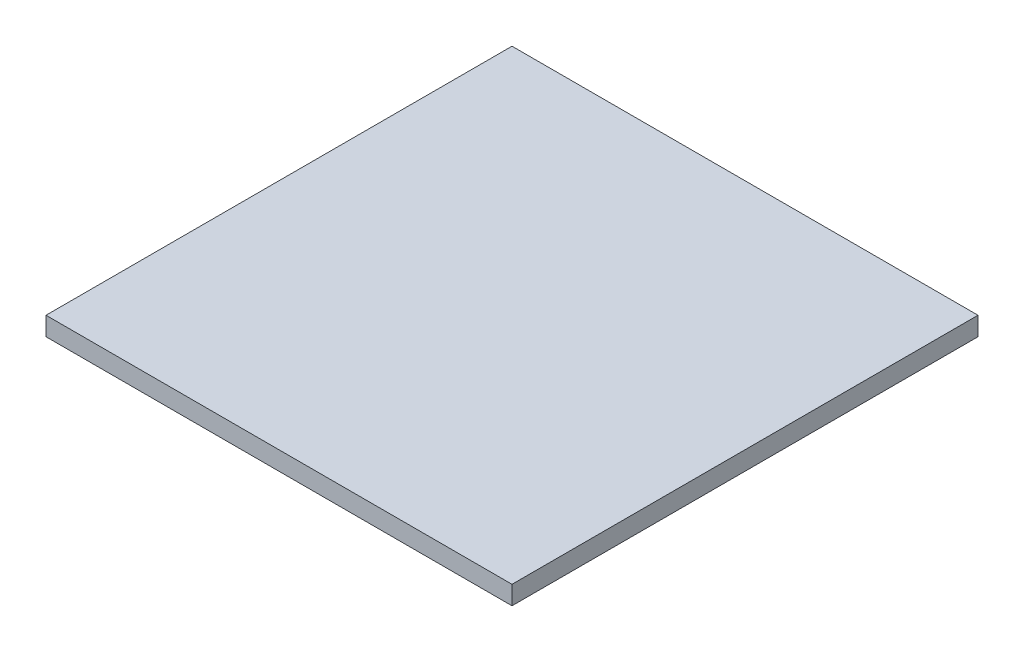
ISO-10303-21;
HEADER;
FILE_DESCRIPTION(('STEP AP214'),'2;1');
FILE_NAME('part.step','',(''),(''),'','','');
FILE_SCHEMA(('AUTOMOTIVE_DESIGN { 1 0 10303 214 1 1 1 1 }'));
ENDSEC;
DATA;
#1=APPLICATION_CONTEXT('core data for automotive mechanical design processes');
#2=APPLICATION_PROTOCOL_DEFINITION('international standard','automotive_design',2000,#1);
#3=PRODUCT_CONTEXT('',#1,'mechanical');
#4=PRODUCT('Part','Part','',(#3));
#5=PRODUCT_RELATED_PRODUCT_CATEGORY('part','',(#4));
#6=PRODUCT_DEFINITION_FORMATION('','',#4);
#7=PRODUCT_DEFINITION_CONTEXT('part definition',#1,'design');
#8=PRODUCT_DEFINITION('design','',#6,#7);
#9=PRODUCT_DEFINITION_SHAPE('','',#8);
#10=(LENGTH_UNIT() NAMED_UNIT(*) SI_UNIT(.MILLI.,.METRE.));
#11=(NAMED_UNIT(*) PLANE_ANGLE_UNIT() SI_UNIT($,.RADIAN.));
#12=(NAMED_UNIT(*) SI_UNIT($,.STERADIAN.) SOLID_ANGLE_UNIT());
#13=UNCERTAINTY_MEASURE_WITH_UNIT(LENGTH_MEASURE(1.E-05),#10,'distance_accuracy_value','');
#14=(GEOMETRIC_REPRESENTATION_CONTEXT(3) GLOBAL_UNCERTAINTY_ASSIGNED_CONTEXT((#13)) GLOBAL_UNIT_ASSIGNED_CONTEXT((#10,
#11,#12)) REPRESENTATION_CONTEXT('',''));
#15=CARTESIAN_POINT('',(0.,0.,0.));
#16=DIRECTION('',(0.,0.,1.));
#17=DIRECTION('',(1.,0.,0.));
#18=AXIS2_PLACEMENT_3D('',#15,#16,#17);
#19=CARTESIAN_POINT('',(0.,2.,0.));
#20=DIRECTION('',(1.,0.,0.));
#21=DIRECTION('',(0.,0.,-1.));
#22=AXIS2_PLACEMENT_3D('',#19,#20,#21);
#23=PLANE('',#22);
#24=DIRECTION('',(0.,0.,1.));
#25=VECTOR('',#24,1.);
#26=CARTESIAN_POINT('',(0.,0.,0.));
#27=LINE('',#26,#25);
#28=CARTESIAN_POINT('',(0.,0.,-50.));
#29=VERTEX_POINT('',#28);
#30=CARTESIAN_POINT('',(0.,0.,0.));
#31=VERTEX_POINT('',#30);
#32=EDGE_CURVE('E96',#29,#31,#27,.T.);
#33=ORIENTED_EDGE('',*,*,#32,.T.);
#34=DIRECTION('',(0.,-1.,0.));
#35=VECTOR('',#34,1.);
#36=CARTESIAN_POINT('',(0.,2.,0.));
#37=LINE('',#36,#35);
#38=CARTESIAN_POINT('',(0.,2.,0.));
#39=VERTEX_POINT('',#38);
#40=EDGE_CURVE('E11',#39,#31,#37,.T.);
#41=ORIENTED_EDGE('',*,*,#40,.F.);
#42=DIRECTION('',(0.,0.,1.));
#43=VECTOR('',#42,1.);
#44=CARTESIAN_POINT('',(0.,2.,0.));
#45=LINE('',#44,#43);
#46=CARTESIAN_POINT('',(0.,2.,-50.));
#47=VERTEX_POINT('',#46);
#48=EDGE_CURVE('E84',#47,#39,#45,.T.);
#49=ORIENTED_EDGE('',*,*,#48,.F.);
#50=DIRECTION('',(0.,-1.,0.));
#51=VECTOR('',#50,1.);
#52=CARTESIAN_POINT('',(0.,2.,-50.));
#53=LINE('',#52,#51);
#54=EDGE_CURVE('E92',#47,#29,#53,.T.);
#55=ORIENTED_EDGE('',*,*,#54,.T.);
#56=EDGE_LOOP('',(#33,#41,#49,#55));
#57=FACE_BOUND('',#56,.T.);
#58=ADVANCED_FACE('F33',(#57),#23,.F.);
#59=CARTESIAN_POINT('',(0.,2.,0.));
#60=DIRECTION('',(0.,0.,-1.));
#61=DIRECTION('',(-1.,0.,0.));
#62=AXIS2_PLACEMENT_3D('',#59,#60,#61);
#63=PLANE('',#62);
#64=DIRECTION('',(1.,0.,0.));
#65=VECTOR('',#64,1.);
#66=CARTESIAN_POINT('',(0.,0.,0.));
#67=LINE('',#66,#65);
#68=CARTESIAN_POINT('',(50.,0.,0.));
#69=VERTEX_POINT('',#68);
#70=EDGE_CURVE('E88',#31,#69,#67,.T.);
#71=ORIENTED_EDGE('',*,*,#70,.T.);
#72=DIRECTION('',(0.,-1.,0.));
#73=VECTOR('',#72,1.);
#74=CARTESIAN_POINT('',(50.,2.,0.));
#75=LINE('',#74,#73);
#76=CARTESIAN_POINT('',(50.,2.,0.));
#77=VERTEX_POINT('',#76);
#78=EDGE_CURVE('E41',#77,#69,#75,.T.);
#79=ORIENTED_EDGE('',*,*,#78,.F.);
#80=DIRECTION('',(1.,0.,0.));
#81=VECTOR('',#80,1.);
#82=CARTESIAN_POINT('',(0.,2.,0.));
#83=LINE('',#82,#81);
#84=EDGE_CURVE('E79',#39,#77,#83,.T.);
#85=ORIENTED_EDGE('',*,*,#84,.F.);
#86=ORIENTED_EDGE('',*,*,#40,.T.);
#87=EDGE_LOOP('',(#71,#79,#85,#86));
#88=FACE_BOUND('',#87,.T.);
#89=ADVANCED_FACE('F87',(#88),#63,.F.);
#90=CARTESIAN_POINT('',(50.,2.,0.));
#91=DIRECTION('',(-1.,0.,0.));
#92=DIRECTION('',(0.,0.,1.));
#93=AXIS2_PLACEMENT_3D('',#90,#91,#92);
#94=PLANE('',#93);
#95=DIRECTION('',(0.,0.,-1.));
#96=VECTOR('',#95,1.);
#97=CARTESIAN_POINT('',(50.,0.,0.));
#98=LINE('',#97,#96);
#99=CARTESIAN_POINT('',(50.,0.,-50.));
#100=VERTEX_POINT('',#99);
#101=EDGE_CURVE('E66',#69,#100,#98,.T.);
#102=ORIENTED_EDGE('',*,*,#101,.T.);
#103=DIRECTION('',(0.,-1.,0.));
#104=VECTOR('',#103,1.);
#105=CARTESIAN_POINT('',(50.,2.,-50.));
#106=LINE('',#105,#104);
#107=CARTESIAN_POINT('',(50.,2.,-50.));
#108=VERTEX_POINT('',#107);
#109=EDGE_CURVE('E89',#108,#100,#106,.T.);
#110=ORIENTED_EDGE('',*,*,#109,.F.);
#111=DIRECTION('',(0.,0.,-1.));
#112=VECTOR('',#111,1.);
#113=CARTESIAN_POINT('',(50.,2.,0.));
#114=LINE('',#113,#112);
#115=EDGE_CURVE('E82',#77,#108,#114,.T.);
#116=ORIENTED_EDGE('',*,*,#115,.F.);
#117=ORIENTED_EDGE('',*,*,#78,.T.);
#118=EDGE_LOOP('',(#102,#110,#116,#117));
#119=FACE_BOUND('',#118,.T.);
#120=ADVANCED_FACE('F90',(#119),#94,.F.);
#121=CARTESIAN_POINT('',(0.,2.,-50.));
#122=DIRECTION('',(0.,0.,1.));
#123=DIRECTION('',(1.,0.,0.));
#124=AXIS2_PLACEMENT_3D('',#121,#122,#123);
#125=PLANE('',#124);
#126=DIRECTION('',(-1.,0.,0.));
#127=VECTOR('',#126,1.);
#128=CARTESIAN_POINT('',(0.,0.,-50.));
#129=LINE('',#128,#127);
#130=EDGE_CURVE('E72',#100,#29,#129,.T.);
#131=ORIENTED_EDGE('',*,*,#130,.T.);
#132=ORIENTED_EDGE('',*,*,#54,.F.);
#133=DIRECTION('',(-1.,0.,0.));
#134=VECTOR('',#133,1.);
#135=CARTESIAN_POINT('',(0.,2.,-50.));
#136=LINE('',#135,#134);
#137=EDGE_CURVE('E49',#108,#47,#136,.T.);
#138=ORIENTED_EDGE('',*,*,#137,.F.);
#139=ORIENTED_EDGE('',*,*,#109,.T.);
#140=EDGE_LOOP('',(#131,#132,#138,#139));
#141=FACE_BOUND('',#140,.T.);
#142=ADVANCED_FACE('F103',(#141),#125,.F.);
#143=CARTESIAN_POINT('',(0.,2.,0.));
#144=DIRECTION('',(0.,-1.,0.));
#145=DIRECTION('',(0.,0.,-1.));
#146=AXIS2_PLACEMENT_3D('',#143,#144,#145);
#147=PLANE('',#146);
#148=ORIENTED_EDGE('',*,*,#48,.T.);
#149=ORIENTED_EDGE('',*,*,#84,.T.);
#150=ORIENTED_EDGE('',*,*,#115,.T.);
#151=ORIENTED_EDGE('',*,*,#137,.T.);
#152=EDGE_LOOP('',(#148,#149,#150,#151));
#153=FACE_BOUND('',#152,.T.);
#154=ADVANCED_FACE('F80',(#153),#147,.F.);
#155=CARTESIAN_POINT('',(0.,0.,0.));
#156=DIRECTION('',(0.,-1.,0.));
#157=DIRECTION('',(0.,0.,-1.));
#158=AXIS2_PLACEMENT_3D('',#155,#156,#157);
#159=PLANE('',#158);
#160=ORIENTED_EDGE('',*,*,#32,.F.);
#161=ORIENTED_EDGE('',*,*,#130,.F.);
#162=ORIENTED_EDGE('',*,*,#101,.F.);
#163=ORIENTED_EDGE('',*,*,#70,.F.);
#164=EDGE_LOOP('',(#160,#161,#162,#163));
#165=FACE_BOUND('',#164,.T.);
#166=ADVANCED_FACE('F106',(#165),#159,.T.);
#167=CLOSED_SHELL('',(#58,#89,#120,#142,#154,#166));
#168=MANIFOLD_SOLID_BREP('B2',#167);
#169=ADVANCED_BREP_SHAPE_REPRESENTATION('',(#18,#168),#14);
#170=SHAPE_DEFINITION_REPRESENTATION(#9,#169);
ENDSEC;
END-ISO-10303-21;
